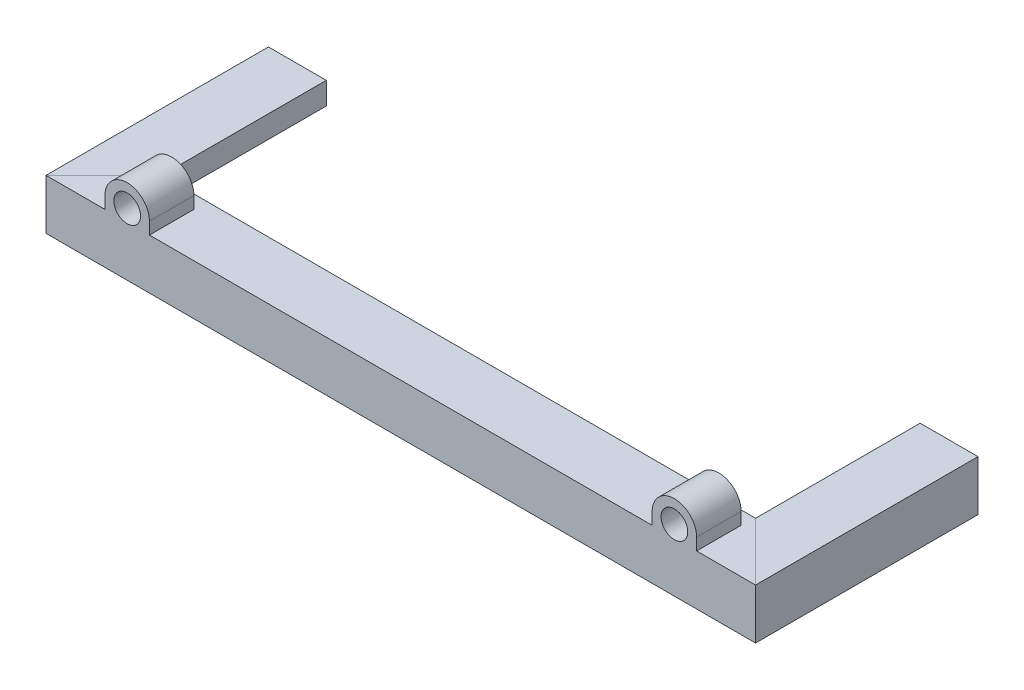
ISO-10303-21;
HEADER;
FILE_DESCRIPTION(('STEP AP214'),'2;1');
FILE_NAME('part.step','',(''),(''),'','','');
FILE_SCHEMA(('AUTOMOTIVE_DESIGN { 1 0 10303 214 1 1 1 1 }'));
ENDSEC;
DATA;
#1=APPLICATION_CONTEXT('core data for automotive mechanical design processes');
#2=APPLICATION_PROTOCOL_DEFINITION('international standard','automotive_design',2000,#1);
#3=PRODUCT_CONTEXT('',#1,'mechanical');
#4=PRODUCT('Part','Part','',(#3));
#5=PRODUCT_RELATED_PRODUCT_CATEGORY('part','',(#4));
#6=PRODUCT_DEFINITION_FORMATION('','',#4);
#7=PRODUCT_DEFINITION_CONTEXT('part definition',#1,'design');
#8=PRODUCT_DEFINITION('design','',#6,#7);
#9=PRODUCT_DEFINITION_SHAPE('','',#8);
#10=(LENGTH_UNIT() NAMED_UNIT(*) SI_UNIT(.MILLI.,.METRE.));
#11=(NAMED_UNIT(*) PLANE_ANGLE_UNIT() SI_UNIT($,.RADIAN.));
#12=(NAMED_UNIT(*) SI_UNIT($,.STERADIAN.) SOLID_ANGLE_UNIT());
#13=UNCERTAINTY_MEASURE_WITH_UNIT(LENGTH_MEASURE(1.E-05),#10,'distance_accuracy_value','');
#14=(GEOMETRIC_REPRESENTATION_CONTEXT(3) GLOBAL_UNCERTAINTY_ASSIGNED_CONTEXT((#13)) GLOBAL_UNIT_ASSIGNED_CONTEXT((#10,
#11,#12)) REPRESENTATION_CONTEXT('',''));
#15=CARTESIAN_POINT('',(0.,0.,0.));
#16=DIRECTION('',(0.,0.,1.));
#17=DIRECTION('',(1.,0.,0.));
#18=AXIS2_PLACEMENT_3D('',#15,#16,#17);
#19=CARTESIAN_POINT('',(0.,11.3,50.));
#20=DIRECTION('',(0.,1.,0.));
#21=DIRECTION('',(0.,0.,1.));
#22=AXIS2_PLACEMENT_3D('',#19,#20,#21);
#23=PLANE('',#22);
#24=DIRECTION('',(-1.,0.,0.));
#25=VECTOR('',#24,1.);
#26=CARTESIAN_POINT('',(146.25,11.3,40.));
#27=LINE('',#26,#25);
#28=CARTESIAN_POINT('',(139.942330316938,11.3,40.));
#29=VERTEX_POINT('',#28);
#30=CARTESIAN_POINT('',(136.25,11.3,40.));
#31=VERTEX_POINT('',#30);
#32=EDGE_CURVE('E228',#29,#31,#27,.T.);
#33=ORIENTED_EDGE('',*,*,#32,.F.);
#34=DIRECTION('',(0.,0.,1.));
#35=VECTOR('',#34,1.);
#36=CARTESIAN_POINT('',(139.942330316938,11.3,0.));
#37=LINE('',#36,#35);
#38=CARTESIAN_POINT('',(139.942330316938,11.3,37.));
#39=VERTEX_POINT('',#38);
#40=EDGE_CURVE('E58',#29,#39,#37,.F.);
#41=ORIENTED_EDGE('',*,*,#40,.T.);
#42=DIRECTION('',(1.,0.,0.));
#43=VECTOR('',#42,1.);
#44=CARTESIAN_POINT('',(0.,11.3,37.));
#45=LINE('',#44,#43);
#46=CARTESIAN_POINT('',(19.5576696830622,11.3,37.));
#47=VERTEX_POINT('',#46);
#48=EDGE_CURVE('E428',#47,#39,#45,.T.);
#49=ORIENTED_EDGE('',*,*,#48,.F.);
#50=DIRECTION('',(0.,0.,1.));
#51=VECTOR('',#50,1.);
#52=CARTESIAN_POINT('',(19.5576696830622,11.3,0.));
#53=LINE('',#52,#51);
#54=CARTESIAN_POINT('',(19.5576696830622,11.3,40.));
#55=VERTEX_POINT('',#54);
#56=EDGE_CURVE('E259',#55,#47,#53,.F.);
#57=ORIENTED_EDGE('',*,*,#56,.F.);
#58=DIRECTION('',(1.,0.,0.));
#59=VECTOR('',#58,1.);
#60=CARTESIAN_POINT('',(13.25,11.3,40.));
#61=LINE('',#60,#59);
#62=CARTESIAN_POINT('',(23.25,11.3,40.));
#63=VERTEX_POINT('',#62);
#64=EDGE_CURVE('E272',#55,#63,#61,.T.);
#65=ORIENTED_EDGE('',*,*,#64,.T.);
#66=DIRECTION('',(0.,0.,1.));
#67=VECTOR('',#66,1.);
#68=CARTESIAN_POINT('',(23.25,11.3,40.));
#69=LINE('',#68,#67);
#70=CARTESIAN_POINT('',(23.25,11.3,50.));
#71=VERTEX_POINT('',#70);
#72=EDGE_CURVE('E302',#63,#71,#69,.T.);
#73=ORIENTED_EDGE('',*,*,#72,.T.);
#74=DIRECTION('',(1.,0.,0.));
#75=VECTOR('',#74,1.);
#76=CARTESIAN_POINT('',(0.,11.3,50.));
#77=LINE('',#76,#75);
#78=CARTESIAN_POINT('',(136.25,11.3,50.));
#79=VERTEX_POINT('',#78);
#80=EDGE_CURVE('E389',#71,#79,#77,.T.);
#81=ORIENTED_EDGE('',*,*,#80,.T.);
#82=DIRECTION('',(0.,0.,1.));
#83=VECTOR('',#82,1.);
#84=CARTESIAN_POINT('',(136.25,11.3,40.));
#85=LINE('',#84,#83);
#86=EDGE_CURVE('E247',#31,#79,#85,.T.);
#87=ORIENTED_EDGE('',*,*,#86,.F.);
#88=EDGE_LOOP('',(#33,#41,#49,#57,#65,#73,#81,#87));
#89=FACE_BOUND('',#88,.T.);
#90=ADVANCED_FACE('F44',(#89),#23,.T.);
#91=CARTESIAN_POINT('',(142.557669683062,11.3,37.));
#92=VERTEX_POINT('',#91);
#93=CARTESIAN_POINT('',(146.5,11.3,37.));
#94=VERTEX_POINT('',#93);
#95=EDGE_CURVE('E217',#92,#94,#45,.T.);
#96=ORIENTED_EDGE('',*,*,#95,.F.);
#97=DIRECTION('',(0.,0.,1.));
#98=VECTOR('',#97,1.);
#99=CARTESIAN_POINT('',(142.557669683062,11.3,0.));
#100=LINE('',#99,#98);
#101=CARTESIAN_POINT('',(142.557669683062,11.3,40.));
#102=VERTEX_POINT('',#101);
#103=EDGE_CURVE('E210',#92,#102,#100,.T.);
#104=ORIENTED_EDGE('',*,*,#103,.T.);
#105=CARTESIAN_POINT('',(146.25,11.3,40.));
#106=VERTEX_POINT('',#105);
#107=EDGE_CURVE('E216',#106,#102,#27,.T.);
#108=ORIENTED_EDGE('',*,*,#107,.F.);
#109=DIRECTION('',(0.,0.,1.));
#110=VECTOR('',#109,1.);
#111=CARTESIAN_POINT('',(146.25,11.3,40.));
#112=LINE('',#111,#110);
#113=CARTESIAN_POINT('',(146.25,11.3,50.));
#114=VERTEX_POINT('',#113);
#115=EDGE_CURVE('E66',#106,#114,#112,.T.);
#116=ORIENTED_EDGE('',*,*,#115,.T.);
#117=CARTESIAN_POINT('',(159.5,11.3,50.));
#118=VERTEX_POINT('',#117);
#119=EDGE_CURVE('E386',#114,#118,#77,.T.);
#120=ORIENTED_EDGE('',*,*,#119,.T.);
#121=DIRECTION('',(-0.707106781186548,0.,-0.707106781186548));
#122=VECTOR('',#121,1.);
#123=CARTESIAN_POINT('',(79.75,11.3,-29.75));
#124=LINE('',#123,#122);
#125=EDGE_CURVE('E398',#118,#94,#124,.T.);
#126=ORIENTED_EDGE('',*,*,#125,.T.);
#127=EDGE_LOOP('',(#96,#104,#108,#116,#120,#126));
#128=FACE_BOUND('',#127,.T.);
#129=ADVANCED_FACE('F214',(#128),#23,.T.);
#130=DIRECTION('',(0.,0.,1.));
#131=VECTOR('',#130,1.);
#132=CARTESIAN_POINT('',(16.9423303169378,11.3,0.));
#133=LINE('',#132,#131);
#134=CARTESIAN_POINT('',(16.9423303169378,11.3,37.));
#135=VERTEX_POINT('',#134);
#136=CARTESIAN_POINT('',(16.9423303169378,11.3,40.));
#137=VERTEX_POINT('',#136);
#138=EDGE_CURVE('E265',#135,#137,#133,.T.);
#139=ORIENTED_EDGE('',*,*,#138,.F.);
#140=CARTESIAN_POINT('',(13.,11.3,37.));
#141=VERTEX_POINT('',#140);
#142=EDGE_CURVE('E424',#141,#135,#45,.T.);
#143=ORIENTED_EDGE('',*,*,#142,.F.);
#144=DIRECTION('',(0.707106781186547,0.,-0.707106781186547));
#145=VECTOR('',#144,1.);
#146=CARTESIAN_POINT('',(25.,11.3,25.));
#147=LINE('',#146,#145);
#148=CARTESIAN_POINT('',(0.,11.3,50.));
#149=VERTEX_POINT('',#148);
#150=EDGE_CURVE('E349',#149,#141,#147,.T.);
#151=ORIENTED_EDGE('',*,*,#150,.F.);
#152=CARTESIAN_POINT('',(13.25,11.3,50.));
#153=VERTEX_POINT('',#152);
#154=EDGE_CURVE('E382',#149,#153,#77,.T.);
#155=ORIENTED_EDGE('',*,*,#154,.T.);
#156=DIRECTION('',(0.,0.,1.));
#157=VECTOR('',#156,1.);
#158=CARTESIAN_POINT('',(13.25,11.3,40.));
#159=LINE('',#158,#157);
#160=CARTESIAN_POINT('',(13.25,11.3,40.));
#161=VERTEX_POINT('',#160);
#162=EDGE_CURVE('E290',#161,#153,#159,.T.);
#163=ORIENTED_EDGE('',*,*,#162,.F.);
#164=EDGE_CURVE('E274',#161,#137,#61,.T.);
#165=ORIENTED_EDGE('',*,*,#164,.T.);
#166=EDGE_LOOP('',(#139,#143,#151,#155,#163,#165));
#167=FACE_BOUND('',#166,.T.);
#168=ADVANCED_FACE('F483',(#167),#23,.T.);
#169=CARTESIAN_POINT('',(159.5,0.,0.));
#170=DIRECTION('',(0.,0.,1.));
#171=DIRECTION('',(1.,0.,0.));
#172=AXIS2_PLACEMENT_3D('',#169,#170,#171);
#173=PLANE('',#172);
#174=DIRECTION('',(-1.,0.,0.));
#175=VECTOR('',#174,1.);
#176=CARTESIAN_POINT('',(154.5,0.,0.));
#177=LINE('',#176,#175);
#178=CARTESIAN_POINT('',(159.5,0.,0.));
#179=VERTEX_POINT('',#178);
#180=CARTESIAN_POINT('',(154.5,0.,0.));
#181=VERTEX_POINT('',#180);
#182=EDGE_CURVE('E434',#179,#181,#177,.T.);
#183=ORIENTED_EDGE('',*,*,#182,.T.);
#184=DIRECTION('',(0.,1.,0.));
#185=VECTOR('',#184,1.);
#186=CARTESIAN_POINT('',(154.5,6.3,0.));
#187=LINE('',#186,#185);
#188=CARTESIAN_POINT('',(154.5,6.3,0.));
#189=VERTEX_POINT('',#188);
#190=EDGE_CURVE('E303',#181,#189,#187,.T.);
#191=ORIENTED_EDGE('',*,*,#190,.T.);
#192=DIRECTION('',(-1.,0.,0.));
#193=VECTOR('',#192,1.);
#194=CARTESIAN_POINT('',(146.5,6.3,0.));
#195=LINE('',#194,#193);
#196=CARTESIAN_POINT('',(146.5,6.3,0.));
#197=VERTEX_POINT('',#196);
#198=EDGE_CURVE('E460',#189,#197,#195,.T.);
#199=ORIENTED_EDGE('',*,*,#198,.T.);
#200=DIRECTION('',(0.,1.,0.));
#201=VECTOR('',#200,1.);
#202=CARTESIAN_POINT('',(146.5,11.3,0.));
#203=LINE('',#202,#201);
#204=CARTESIAN_POINT('',(146.5,11.3,0.));
#205=VERTEX_POINT('',#204);
#206=EDGE_CURVE('E451',#197,#205,#203,.T.);
#207=ORIENTED_EDGE('',*,*,#206,.T.);
#208=DIRECTION('',(1.,0.,0.));
#209=VECTOR('',#208,1.);
#210=CARTESIAN_POINT('',(159.5,11.3,0.));
#211=LINE('',#210,#209);
#212=CARTESIAN_POINT('',(159.5,11.3,0.));
#213=VERTEX_POINT('',#212);
#214=EDGE_CURVE('E450',#205,#213,#211,.T.);
#215=ORIENTED_EDGE('',*,*,#214,.T.);
#216=DIRECTION('',(0.,-1.,0.));
#217=VECTOR('',#216,1.);
#218=CARTESIAN_POINT('',(159.5,0.,0.));
#219=LINE('',#218,#217);
#220=EDGE_CURVE('E445',#213,#179,#219,.T.);
#221=ORIENTED_EDGE('',*,*,#220,.T.);
#222=EDGE_LOOP('',(#183,#191,#199,#207,#215,#221));
#223=FACE_BOUND('',#222,.T.);
#224=ADVANCED_FACE('F50',(#223),#173,.F.);
#225=CARTESIAN_POINT('',(0.,0.,0.));
#226=DIRECTION('',(0.,0.,-1.));
#227=DIRECTION('',(-1.,0.,0.));
#228=AXIS2_PLACEMENT_3D('',#225,#226,#227);
#229=PLANE('',#228);
#230=DIRECTION('',(1.,0.,0.));
#231=VECTOR('',#230,1.);
#232=CARTESIAN_POINT('',(5.,0.,0.));
#233=LINE('',#232,#231);
#234=CARTESIAN_POINT('',(0.,0.,0.));
#235=VERTEX_POINT('',#234);
#236=CARTESIAN_POINT('',(5.,0.,0.));
#237=VERTEX_POINT('',#236);
#238=EDGE_CURVE('E312',#235,#237,#233,.T.);
#239=ORIENTED_EDGE('',*,*,#238,.F.);
#240=DIRECTION('',(0.,-1.,0.));
#241=VECTOR('',#240,1.);
#242=CARTESIAN_POINT('',(0.,0.,0.));
#243=LINE('',#242,#241);
#244=CARTESIAN_POINT('',(0.,11.3,0.));
#245=VERTEX_POINT('',#244);
#246=EDGE_CURVE('E319',#245,#235,#243,.T.);
#247=ORIENTED_EDGE('',*,*,#246,.F.);
#248=DIRECTION('',(-1.,0.,0.));
#249=VECTOR('',#248,1.);
#250=CARTESIAN_POINT('',(0.,11.3,0.));
#251=LINE('',#250,#249);
#252=CARTESIAN_POINT('',(13.,11.3,0.));
#253=VERTEX_POINT('',#252);
#254=EDGE_CURVE('E334',#253,#245,#251,.T.);
#255=ORIENTED_EDGE('',*,*,#254,.F.);
#256=DIRECTION('',(0.,1.,0.));
#257=VECTOR('',#256,1.);
#258=CARTESIAN_POINT('',(13.,11.3,0.));
#259=LINE('',#258,#257);
#260=CARTESIAN_POINT('',(13.,6.3,0.));
#261=VERTEX_POINT('',#260);
#262=EDGE_CURVE('E343',#261,#253,#259,.T.);
#263=ORIENTED_EDGE('',*,*,#262,.F.);
#264=DIRECTION('',(1.,0.,0.));
#265=VECTOR('',#264,1.);
#266=CARTESIAN_POINT('',(13.,6.3,0.));
#267=LINE('',#266,#265);
#268=CARTESIAN_POINT('',(5.,6.3,0.));
#269=VERTEX_POINT('',#268);
#270=EDGE_CURVE('E342',#269,#261,#267,.T.);
#271=ORIENTED_EDGE('',*,*,#270,.F.);
#272=DIRECTION('',(0.,1.,0.));
#273=VECTOR('',#272,1.);
#274=CARTESIAN_POINT('',(5.,6.3,0.));
#275=LINE('',#274,#273);
#276=EDGE_CURVE('E313',#237,#269,#275,.T.);
#277=ORIENTED_EDGE('',*,*,#276,.F.);
#278=EDGE_LOOP('',(#239,#247,#255,#263,#271,#277));
#279=FACE_BOUND('',#278,.T.);
#280=ADVANCED_FACE('F535',(#279),#229,.T.);
#281=CARTESIAN_POINT('',(146.5,6.3,50.));
#282=DIRECTION('',(0.,-1.,0.));
#283=DIRECTION('',(1.,0.,0.));
#284=AXIS2_PLACEMENT_3D('',#281,#282,#283);
#285=PLANE('',#284);
#286=DIRECTION('',(0.707106781186548,0.,0.707106781186548));
#287=VECTOR('',#286,1.);
#288=CARTESIAN_POINT('',(73.25,6.30000000000002,-36.25));
#289=LINE('',#288,#287);
#290=CARTESIAN_POINT('',(146.5,6.3,37.));
#291=VERTEX_POINT('',#290);
#292=CARTESIAN_POINT('',(154.5,6.3,45.));
#293=VERTEX_POINT('',#292);
#294=EDGE_CURVE('E404',#291,#293,#289,.T.);
#295=ORIENTED_EDGE('',*,*,#294,.F.);
#296=DIRECTION('',(0.,0.,-1.));
#297=VECTOR('',#296,1.);
#298=CARTESIAN_POINT('',(146.5,6.3,50.));
#299=LINE('',#298,#297);
#300=EDGE_CURVE('E457',#291,#197,#299,.T.);
#301=ORIENTED_EDGE('',*,*,#300,.T.);
#302=ORIENTED_EDGE('',*,*,#198,.F.);
#303=DIRECTION('',(0.,0.,-1.));
#304=VECTOR('',#303,1.);
#305=CARTESIAN_POINT('',(154.5,6.3,50.));
#306=LINE('',#305,#304);
#307=EDGE_CURVE('E418',#293,#189,#306,.T.);
#308=ORIENTED_EDGE('',*,*,#307,.F.);
#309=EDGE_LOOP('',(#295,#301,#302,#308));
#310=FACE_BOUND('',#309,.T.);
#311=ADVANCED_FACE('F554',(#310),#285,.T.);
#312=CARTESIAN_POINT('',(146.5,11.3,50.));
#313=DIRECTION('',(-1.,0.,0.));
#314=DIRECTION('',(0.,0.,1.));
#315=AXIS2_PLACEMENT_3D('',#312,#313,#314);
#316=PLANE('',#315);
#317=DIRECTION('',(0.,-1.,0.));
#318=VECTOR('',#317,1.);
#319=CARTESIAN_POINT('',(146.5,11.3,37.));
#320=LINE('',#319,#318);
#321=EDGE_CURVE('E399',#94,#291,#320,.T.);
#322=ORIENTED_EDGE('',*,*,#321,.F.);
#323=DIRECTION('',(0.,0.,-1.));
#324=VECTOR('',#323,1.);
#325=CARTESIAN_POINT('',(146.5,11.3,50.));
#326=LINE('',#325,#324);
#327=EDGE_CURVE('E455',#94,#205,#326,.T.);
#328=ORIENTED_EDGE('',*,*,#327,.T.);
#329=ORIENTED_EDGE('',*,*,#206,.F.);
#330=ORIENTED_EDGE('',*,*,#300,.F.);
#331=EDGE_LOOP('',(#322,#328,#329,#330));
#332=FACE_BOUND('',#331,.T.);
#333=ADVANCED_FACE('F557',(#332),#316,.T.);
#334=CARTESIAN_POINT('',(159.5,11.3,50.));
#335=DIRECTION('',(0.,1.,0.));
#336=DIRECTION('',(0.,0.,1.));
#337=AXIS2_PLACEMENT_3D('',#334,#335,#336);
#338=PLANE('',#337);
#339=ORIENTED_EDGE('',*,*,#125,.F.);
#340=DIRECTION('',(0.,0.,-1.));
#341=VECTOR('',#340,1.);
#342=CARTESIAN_POINT('',(159.5,11.3,50.));
#343=LINE('',#342,#341);
#344=EDGE_CURVE('E443',#118,#213,#343,.T.);
#345=ORIENTED_EDGE('',*,*,#344,.T.);
#346=ORIENTED_EDGE('',*,*,#214,.F.);
#347=ORIENTED_EDGE('',*,*,#327,.F.);
#348=EDGE_LOOP('',(#339,#345,#346,#347));
#349=FACE_BOUND('',#348,.T.);
#350=ADVANCED_FACE('F514',(#349),#338,.T.);
#351=CARTESIAN_POINT('',(159.5,0.,50.));
#352=DIRECTION('',(1.,0.,0.));
#353=DIRECTION('',(0.,0.,-1.));
#354=AXIS2_PLACEMENT_3D('',#351,#352,#353);
#355=PLANE('',#354);
#356=DIRECTION('',(0.,0.,-1.));
#357=VECTOR('',#356,1.);
#358=CARTESIAN_POINT('',(159.5,0.,50.));
#359=LINE('',#358,#357);
#360=CARTESIAN_POINT('',(159.5,0.,50.));
#361=VERTEX_POINT('',#360);
#362=EDGE_CURVE('E437',#361,#179,#359,.T.);
#363=ORIENTED_EDGE('',*,*,#362,.T.);
#364=ORIENTED_EDGE('',*,*,#220,.F.);
#365=ORIENTED_EDGE('',*,*,#344,.F.);
#366=DIRECTION('',(0.,-1.,0.));
#367=VECTOR('',#366,1.);
#368=CARTESIAN_POINT('',(159.5,0.,50.));
#369=LINE('',#368,#367);
#370=EDGE_CURVE('E390',#118,#361,#369,.T.);
#371=ORIENTED_EDGE('',*,*,#370,.T.);
#372=EDGE_LOOP('',(#363,#364,#365,#371));
#373=FACE_BOUND('',#372,.T.);
#374=ADVANCED_FACE('F517',(#373),#355,.T.);
#375=CARTESIAN_POINT('',(154.5,0.,50.));
#376=DIRECTION('',(0.,-1.,0.));
#377=DIRECTION('',(1.,0.,0.));
#378=AXIS2_PLACEMENT_3D('',#375,#376,#377);
#379=PLANE('',#378);
#380=DIRECTION('',(0.707106781186548,0.,0.707106781186548));
#381=VECTOR('',#380,1.);
#382=CARTESIAN_POINT('',(77.25,0.,-32.25));
#383=LINE('',#382,#381);
#384=CARTESIAN_POINT('',(154.5,0.,45.));
#385=VERTEX_POINT('',#384);
#386=EDGE_CURVE('E415',#385,#361,#383,.T.);
#387=ORIENTED_EDGE('',*,*,#386,.F.);
#388=DIRECTION('',(0.,0.,-1.));
#389=VECTOR('',#388,1.);
#390=CARTESIAN_POINT('',(154.5,0.,50.));
#391=LINE('',#390,#389);
#392=EDGE_CURVE('E432',#385,#181,#391,.T.);
#393=ORIENTED_EDGE('',*,*,#392,.T.);
#394=ORIENTED_EDGE('',*,*,#182,.F.);
#395=ORIENTED_EDGE('',*,*,#362,.F.);
#396=EDGE_LOOP('',(#387,#393,#394,#395));
#397=FACE_BOUND('',#396,.T.);
#398=ADVANCED_FACE('F773',(#397),#379,.T.);
#399=CARTESIAN_POINT('',(154.5,6.3,50.));
#400=DIRECTION('',(-1.,0.,0.));
#401=DIRECTION('',(0.,-1.,0.));
#402=AXIS2_PLACEMENT_3D('',#399,#400,#401);
#403=PLANE('',#402);
#404=DIRECTION('',(0.,-1.,0.));
#405=VECTOR('',#404,1.);
#406=CARTESIAN_POINT('',(154.5,6.29999999999998,45.));
#407=LINE('',#406,#405);
#408=EDGE_CURVE('E397',#293,#385,#407,.T.);
#409=ORIENTED_EDGE('',*,*,#408,.F.);
#410=ORIENTED_EDGE('',*,*,#307,.T.);
#411=ORIENTED_EDGE('',*,*,#190,.F.);
#412=ORIENTED_EDGE('',*,*,#392,.F.);
#413=EDGE_LOOP('',(#409,#410,#411,#412));
#414=FACE_BOUND('',#413,.T.);
#415=ADVANCED_FACE('F621',(#414),#403,.T.);
#416=CARTESIAN_POINT('',(0.,0.,50.));
#417=DIRECTION('',(0.,0.,1.));
#418=DIRECTION('',(1.,0.,0.));
#419=AXIS2_PLACEMENT_3D('',#416,#417,#418);
#420=PLANE('',#419);
#421=CARTESIAN_POINT('',(141.25,14.,50.));
#422=DIRECTION('',(0.,0.,-1.));
#423=DIRECTION('',(-1.,0.,0.));
#424=AXIS2_PLACEMENT_3D('',#421,#422,#423);
#425=CIRCLE('',#424,3.);
#426=CARTESIAN_POINT('',(138.25,14.,50.));
#427=VERTEX_POINT('',#426);
#428=EDGE_CURVE('E219',#427,#427,#425,.T.);
#429=ORIENTED_EDGE('',*,*,#428,.T.);
#430=EDGE_LOOP('',(#429));
#431=FACE_BOUND('',#430,.T.);
#432=CARTESIAN_POINT('',(18.25,14.,50.));
#433=DIRECTION('',(0.,0.,1.));
#434=DIRECTION('',(1.,0.,0.));
#435=AXIS2_PLACEMENT_3D('',#432,#433,#434);
#436=CIRCLE('',#435,3.);
#437=CARTESIAN_POINT('',(21.25,14.,50.));
#438=VERTEX_POINT('',#437);
#439=EDGE_CURVE('E249',#438,#438,#436,.T.);
#440=ORIENTED_EDGE('',*,*,#439,.F.);
#441=EDGE_LOOP('',(#440));
#442=FACE_BOUND('',#441,.T.);
#443=DIRECTION('',(1.,0.,0.));
#444=VECTOR('',#443,1.);
#445=CARTESIAN_POINT('',(0.,0.,50.));
#446=LINE('',#445,#444);
#447=CARTESIAN_POINT('',(0.,0.,50.));
#448=VERTEX_POINT('',#447);
#449=EDGE_CURVE('E394',#448,#361,#446,.T.);
#450=ORIENTED_EDGE('',*,*,#449,.T.);
#451=ORIENTED_EDGE('',*,*,#370,.F.);
#452=ORIENTED_EDGE('',*,*,#119,.F.);
#453=DIRECTION('',(0.,-1.,0.));
#454=VECTOR('',#453,1.);
#455=CARTESIAN_POINT('',(146.25,11.3,50.));
#456=LINE('',#455,#454);
#457=CARTESIAN_POINT('',(146.25,14.,50.));
#458=VERTEX_POINT('',#457);
#459=EDGE_CURVE('E240',#458,#114,#456,.T.);
#460=ORIENTED_EDGE('',*,*,#459,.F.);
#461=CARTESIAN_POINT('',(141.25,14.,50.));
#462=DIRECTION('',(0.,0.,-1.));
#463=DIRECTION('',(-1.,0.,0.));
#464=AXIS2_PLACEMENT_3D('',#461,#462,#463);
#465=CIRCLE('',#464,5.);
#466=CARTESIAN_POINT('',(136.25,14.,50.));
#467=VERTEX_POINT('',#466);
#468=EDGE_CURVE('E238',#467,#458,#465,.T.);
#469=ORIENTED_EDGE('',*,*,#468,.F.);
#470=DIRECTION('',(0.,1.,0.));
#471=VECTOR('',#470,1.);
#472=CARTESIAN_POINT('',(136.25,11.3,50.));
#473=LINE('',#472,#471);
#474=EDGE_CURVE('E245',#79,#467,#473,.T.);
#475=ORIENTED_EDGE('',*,*,#474,.F.);
#476=ORIENTED_EDGE('',*,*,#80,.F.);
#477=DIRECTION('',(0.,1.,0.));
#478=VECTOR('',#477,1.);
#479=CARTESIAN_POINT('',(23.25,11.3,50.));
#480=LINE('',#479,#478);
#481=CARTESIAN_POINT('',(23.25,14.,50.));
#482=VERTEX_POINT('',#481);
#483=EDGE_CURVE('E292',#71,#482,#480,.T.);
#484=ORIENTED_EDGE('',*,*,#483,.T.);
#485=CARTESIAN_POINT('',(18.25,14.,50.));
#486=DIRECTION('',(0.,0.,1.));
#487=DIRECTION('',(1.,0.,0.));
#488=AXIS2_PLACEMENT_3D('',#485,#486,#487);
#489=CIRCLE('',#488,5.);
#490=CARTESIAN_POINT('',(13.25,14.,50.));
#491=VERTEX_POINT('',#490);
#492=EDGE_CURVE('E273',#482,#491,#489,.T.);
#493=ORIENTED_EDGE('',*,*,#492,.T.);
#494=DIRECTION('',(0.,-1.,0.));
#495=VECTOR('',#494,1.);
#496=CARTESIAN_POINT('',(13.25,11.3,50.));
#497=LINE('',#496,#495);
#498=EDGE_CURVE('E268',#491,#153,#497,.T.);
#499=ORIENTED_EDGE('',*,*,#498,.T.);
#500=ORIENTED_EDGE('',*,*,#154,.F.);
#501=DIRECTION('',(0.,-1.,0.));
#502=VECTOR('',#501,1.);
#503=CARTESIAN_POINT('',(0.,0.,50.));
#504=LINE('',#503,#502);
#505=EDGE_CURVE('E324',#149,#448,#504,.T.);
#506=ORIENTED_EDGE('',*,*,#505,.T.);
#507=EDGE_LOOP('',(#450,#451,#452,#460,#469,#475,#476,#484,#493,#499,#500,#506));
#508=FACE_BOUND('',#507,.T.);
#509=ADVANCED_FACE('F489',(#431,#442,#508),#420,.T.);
#510=CARTESIAN_POINT('',(0.,6.3,37.));
#511=DIRECTION('',(0.,-1.,0.));
#512=DIRECTION('',(0.,0.,-1.));
#513=AXIS2_PLACEMENT_3D('',#510,#511,#512);
#514=PLANE('',#513);
#515=DIRECTION('',(1.,0.,0.));
#516=VECTOR('',#515,1.);
#517=CARTESIAN_POINT('',(0.,6.3,37.));
#518=LINE('',#517,#516);
#519=CARTESIAN_POINT('',(13.,6.3,37.));
#520=VERTEX_POINT('',#519);
#521=EDGE_CURVE('E419',#520,#291,#518,.T.);
#522=ORIENTED_EDGE('',*,*,#521,.T.);
#523=ORIENTED_EDGE('',*,*,#294,.T.);
#524=DIRECTION('',(1.,0.,0.));
#525=VECTOR('',#524,1.);
#526=CARTESIAN_POINT('',(0.,6.3,45.));
#527=LINE('',#526,#525);
#528=CARTESIAN_POINT('',(5.,6.3,45.));
#529=VERTEX_POINT('',#528);
#530=EDGE_CURVE('E407',#529,#293,#527,.T.);
#531=ORIENTED_EDGE('',*,*,#530,.F.);
#532=DIRECTION('',(-0.707106781186548,0.,0.707106781186548));
#533=VECTOR('',#532,1.);
#534=CARTESIAN_POINT('',(31.5,6.30000000000001,18.5));
#535=LINE('',#534,#533);
#536=EDGE_CURVE('E356',#520,#529,#535,.T.);
#537=ORIENTED_EDGE('',*,*,#536,.F.);
#538=EDGE_LOOP('',(#522,#523,#531,#537));
#539=FACE_BOUND('',#538,.T.);
#540=ADVANCED_FACE('F547',(#539),#514,.T.);
#541=CARTESIAN_POINT('',(0.,11.3,37.));
#542=DIRECTION('',(0.,0.,-1.));
#543=DIRECTION('',(-1.,0.,0.));
#544=AXIS2_PLACEMENT_3D('',#541,#542,#543);
#545=PLANE('',#544);
#546=ORIENTED_EDGE('',*,*,#48,.T.);
#547=CARTESIAN_POINT('',(141.25,14.,37.));
#548=DIRECTION('',(0.,0.,-1.));
#549=DIRECTION('',(-1.,0.,0.));
#550=AXIS2_PLACEMENT_3D('',#547,#548,#549);
#551=CIRCLE('',#550,3.);
#552=EDGE_CURVE('E243',#39,#92,#551,.F.);
#553=ORIENTED_EDGE('',*,*,#552,.T.);
#554=ORIENTED_EDGE('',*,*,#95,.T.);
#555=ORIENTED_EDGE('',*,*,#321,.T.);
#556=ORIENTED_EDGE('',*,*,#521,.F.);
#557=DIRECTION('',(0.,-1.,0.));
#558=VECTOR('',#557,1.);
#559=CARTESIAN_POINT('',(13.,11.3,37.));
#560=LINE('',#559,#558);
#561=EDGE_CURVE('E352',#141,#520,#560,.T.);
#562=ORIENTED_EDGE('',*,*,#561,.F.);
#563=ORIENTED_EDGE('',*,*,#142,.T.);
#564=CARTESIAN_POINT('',(18.25,14.,37.));
#565=DIRECTION('',(0.,0.,-1.));
#566=DIRECTION('',(-1.,0.,0.));
#567=AXIS2_PLACEMENT_3D('',#564,#565,#566);
#568=CIRCLE('',#567,3.);
#569=EDGE_CURVE('E264',#47,#135,#568,.T.);
#570=ORIENTED_EDGE('',*,*,#569,.F.);
#571=EDGE_LOOP('',(#546,#553,#554,#555,#556,#562,#563,#570));
#572=FACE_BOUND('',#571,.T.);
#573=ADVANCED_FACE('F563',(#572),#545,.T.);
#574=CARTESIAN_POINT('',(0.,0.,45.));
#575=DIRECTION('',(0.,-1.,0.));
#576=DIRECTION('',(0.,0.,-1.));
#577=AXIS2_PLACEMENT_3D('',#574,#575,#576);
#578=PLANE('',#577);
#579=DIRECTION('',(1.,0.,0.));
#580=VECTOR('',#579,1.);
#581=CARTESIAN_POINT('',(0.,0.,45.));
#582=LINE('',#581,#580);
#583=CARTESIAN_POINT('',(5.,0.,45.));
#584=VERTEX_POINT('',#583);
#585=EDGE_CURVE('E369',#584,#385,#582,.T.);
#586=ORIENTED_EDGE('',*,*,#585,.T.);
#587=ORIENTED_EDGE('',*,*,#386,.T.);
#588=ORIENTED_EDGE('',*,*,#449,.F.);
#589=DIRECTION('',(-0.707106781186548,0.,0.707106781186548));
#590=VECTOR('',#589,1.);
#591=CARTESIAN_POINT('',(27.5,0.,22.5));
#592=LINE('',#591,#590);
#593=EDGE_CURVE('E364',#584,#448,#592,.T.);
#594=ORIENTED_EDGE('',*,*,#593,.F.);
#595=EDGE_LOOP('',(#586,#587,#588,#594));
#596=FACE_BOUND('',#595,.T.);
#597=ADVANCED_FACE('F525',(#596),#578,.T.);
#598=CARTESIAN_POINT('',(0.,6.3,45.));
#599=DIRECTION('',(0.,0.,-1.));
#600=DIRECTION('',(0.,1.,0.));
#601=AXIS2_PLACEMENT_3D('',#598,#599,#600);
#602=PLANE('',#601);
#603=ORIENTED_EDGE('',*,*,#530,.T.);
#604=ORIENTED_EDGE('',*,*,#408,.T.);
#605=ORIENTED_EDGE('',*,*,#585,.F.);
#606=DIRECTION('',(0.,-1.,0.));
#607=VECTOR('',#606,1.);
#608=CARTESIAN_POINT('',(5.,6.29999999999999,45.));
#609=LINE('',#608,#607);
#610=EDGE_CURVE('E355',#529,#584,#609,.T.);
#611=ORIENTED_EDGE('',*,*,#610,.F.);
#612=EDGE_LOOP('',(#603,#604,#605,#611));
#613=FACE_BOUND('',#612,.T.);
#614=ADVANCED_FACE('F546',(#613),#602,.T.);
#615=CARTESIAN_POINT('',(0.,0.,0.));
#616=DIRECTION('',(-1.,0.,0.));
#617=DIRECTION('',(0.,0.,1.));
#618=AXIS2_PLACEMENT_3D('',#615,#616,#617);
#619=PLANE('',#618);
#620=DIRECTION('',(0.,0.,1.));
#621=VECTOR('',#620,1.);
#622=CARTESIAN_POINT('',(0.,0.,0.));
#623=LINE('',#622,#621);
#624=EDGE_CURVE('E321',#235,#448,#623,.T.);
#625=ORIENTED_EDGE('',*,*,#624,.T.);
#626=ORIENTED_EDGE('',*,*,#505,.F.);
#627=DIRECTION('',(0.,0.,1.));
#628=VECTOR('',#627,1.);
#629=CARTESIAN_POINT('',(0.,11.3,0.));
#630=LINE('',#629,#628);
#631=EDGE_CURVE('E328',#245,#149,#630,.T.);
#632=ORIENTED_EDGE('',*,*,#631,.F.);
#633=ORIENTED_EDGE('',*,*,#246,.T.);
#634=EDGE_LOOP('',(#625,#626,#632,#633));
#635=FACE_BOUND('',#634,.T.);
#636=ADVANCED_FACE('F530',(#635),#619,.T.);
#637=CARTESIAN_POINT('',(13.,6.3,0.));
#638=DIRECTION('',(0.,-1.,0.));
#639=DIRECTION('',(1.,0.,0.));
#640=AXIS2_PLACEMENT_3D('',#637,#638,#639);
#641=PLANE('',#640);
#642=DIRECTION('',(0.,0.,1.));
#643=VECTOR('',#642,1.);
#644=CARTESIAN_POINT('',(13.,6.3,0.));
#645=LINE('',#644,#643);
#646=EDGE_CURVE('E376',#261,#520,#645,.T.);
#647=ORIENTED_EDGE('',*,*,#646,.T.);
#648=ORIENTED_EDGE('',*,*,#536,.T.);
#649=DIRECTION('',(0.,0.,1.));
#650=VECTOR('',#649,1.);
#651=CARTESIAN_POINT('',(5.,6.3,0.));
#652=LINE('',#651,#650);
#653=EDGE_CURVE('E316',#269,#529,#652,.T.);
#654=ORIENTED_EDGE('',*,*,#653,.F.);
#655=ORIENTED_EDGE('',*,*,#270,.T.);
#656=EDGE_LOOP('',(#647,#648,#654,#655));
#657=FACE_BOUND('',#656,.T.);
#658=ADVANCED_FACE('F541',(#657),#641,.T.);
#659=CARTESIAN_POINT('',(13.,11.3,0.));
#660=DIRECTION('',(1.,0.,0.));
#661=DIRECTION('',(0.,0.,-1.));
#662=AXIS2_PLACEMENT_3D('',#659,#660,#661);
#663=PLANE('',#662);
#664=DIRECTION('',(0.,0.,1.));
#665=VECTOR('',#664,1.);
#666=CARTESIAN_POINT('',(13.,11.3,0.));
#667=LINE('',#666,#665);
#668=EDGE_CURVE('E339',#253,#141,#667,.T.);
#669=ORIENTED_EDGE('',*,*,#668,.T.);
#670=ORIENTED_EDGE('',*,*,#561,.T.);
#671=ORIENTED_EDGE('',*,*,#646,.F.);
#672=ORIENTED_EDGE('',*,*,#262,.T.);
#673=EDGE_LOOP('',(#669,#670,#671,#672));
#674=FACE_BOUND('',#673,.T.);
#675=ADVANCED_FACE('F540',(#674),#663,.T.);
#676=CARTESIAN_POINT('',(0.,11.3,0.));
#677=DIRECTION('',(0.,1.,0.));
#678=DIRECTION('',(0.,0.,1.));
#679=AXIS2_PLACEMENT_3D('',#676,#677,#678);
#680=PLANE('',#679);
#681=ORIENTED_EDGE('',*,*,#631,.T.);
#682=ORIENTED_EDGE('',*,*,#150,.T.);
#683=ORIENTED_EDGE('',*,*,#668,.F.);
#684=ORIENTED_EDGE('',*,*,#254,.T.);
#685=EDGE_LOOP('',(#681,#682,#683,#684));
#686=FACE_BOUND('',#685,.T.);
#687=ADVANCED_FACE('F532',(#686),#680,.T.);
#688=CARTESIAN_POINT('',(5.,0.,0.));
#689=DIRECTION('',(0.,-1.,0.));
#690=DIRECTION('',(1.,0.,0.));
#691=AXIS2_PLACEMENT_3D('',#688,#689,#690);
#692=PLANE('',#691);
#693=DIRECTION('',(0.,0.,1.));
#694=VECTOR('',#693,1.);
#695=CARTESIAN_POINT('',(5.,0.,0.));
#696=LINE('',#695,#694);
#697=EDGE_CURVE('E326',#237,#584,#696,.T.);
#698=ORIENTED_EDGE('',*,*,#697,.T.);
#699=ORIENTED_EDGE('',*,*,#593,.T.);
#700=ORIENTED_EDGE('',*,*,#624,.F.);
#701=ORIENTED_EDGE('',*,*,#238,.T.);
#702=EDGE_LOOP('',(#698,#699,#700,#701));
#703=FACE_BOUND('',#702,.T.);
#704=ADVANCED_FACE('F528',(#703),#692,.T.);
#705=CARTESIAN_POINT('',(5.,6.3,0.));
#706=DIRECTION('',(1.,0.,0.));
#707=DIRECTION('',(0.,1.,0.));
#708=AXIS2_PLACEMENT_3D('',#705,#706,#707);
#709=PLANE('',#708);
#710=ORIENTED_EDGE('',*,*,#653,.T.);
#711=ORIENTED_EDGE('',*,*,#610,.T.);
#712=ORIENTED_EDGE('',*,*,#697,.F.);
#713=ORIENTED_EDGE('',*,*,#276,.T.);
#714=EDGE_LOOP('',(#710,#711,#712,#713));
#715=FACE_BOUND('',#714,.T.);
#716=ADVANCED_FACE('F543',(#715),#709,.T.);
#717=CARTESIAN_POINT('',(13.25,11.3,40.));
#718=DIRECTION('',(-1.,0.,0.));
#719=DIRECTION('',(0.,0.,1.));
#720=AXIS2_PLACEMENT_3D('',#717,#718,#719);
#721=PLANE('',#720);
#722=ORIENTED_EDGE('',*,*,#498,.F.);
#723=DIRECTION('',(0.,0.,1.));
#724=VECTOR('',#723,1.);
#725=CARTESIAN_POINT('',(13.25,14.,40.));
#726=LINE('',#725,#724);
#727=CARTESIAN_POINT('',(13.25,14.,40.));
#728=VERTEX_POINT('',#727);
#729=EDGE_CURVE('E297',#728,#491,#726,.T.);
#730=ORIENTED_EDGE('',*,*,#729,.F.);
#731=DIRECTION('',(0.,-1.,0.));
#732=VECTOR('',#731,1.);
#733=CARTESIAN_POINT('',(13.25,11.3,40.));
#734=LINE('',#733,#732);
#735=EDGE_CURVE('E267',#728,#161,#734,.T.);
#736=ORIENTED_EDGE('',*,*,#735,.T.);
#737=ORIENTED_EDGE('',*,*,#162,.T.);
#738=EDGE_LOOP('',(#722,#730,#736,#737));
#739=FACE_BOUND('',#738,.T.);
#740=ADVANCED_FACE('F488',(#739),#721,.T.);
#741=CARTESIAN_POINT('',(18.25,14.,40.));
#742=DIRECTION('',(0.,0.,1.));
#743=DIRECTION('',(1.,0.,0.));
#744=AXIS2_PLACEMENT_3D('',#741,#742,#743);
#745=CYLINDRICAL_SURFACE('',#744,5.);
#746=ORIENTED_EDGE('',*,*,#492,.F.);
#747=DIRECTION('',(0.,0.,1.));
#748=VECTOR('',#747,1.);
#749=CARTESIAN_POINT('',(23.25,14.,40.));
#750=LINE('',#749,#748);
#751=CARTESIAN_POINT('',(23.25,14.,40.));
#752=VERTEX_POINT('',#751);
#753=EDGE_CURVE('E305',#752,#482,#750,.T.);
#754=ORIENTED_EDGE('',*,*,#753,.F.);
#755=CARTESIAN_POINT('',(18.25,14.,40.));
#756=DIRECTION('',(0.,0.,1.));
#757=DIRECTION('',(1.,0.,0.));
#758=AXIS2_PLACEMENT_3D('',#755,#756,#757);
#759=CIRCLE('',#758,5.);
#760=EDGE_CURVE('E282',#752,#728,#759,.T.);
#761=ORIENTED_EDGE('',*,*,#760,.T.);
#762=ORIENTED_EDGE('',*,*,#729,.T.);
#763=EDGE_LOOP('',(#746,#754,#761,#762));
#764=FACE_BOUND('',#763,.T.);
#765=ADVANCED_FACE('F494',(#764),#745,.T.);
#766=CARTESIAN_POINT('',(23.25,11.3,40.));
#767=DIRECTION('',(1.,0.,0.));
#768=DIRECTION('',(0.,1.,0.));
#769=AXIS2_PLACEMENT_3D('',#766,#767,#768);
#770=PLANE('',#769);
#771=ORIENTED_EDGE('',*,*,#483,.F.);
#772=ORIENTED_EDGE('',*,*,#72,.F.);
#773=DIRECTION('',(0.,1.,0.));
#774=VECTOR('',#773,1.);
#775=CARTESIAN_POINT('',(23.25,11.3,40.));
#776=LINE('',#775,#774);
#777=EDGE_CURVE('E276',#63,#752,#776,.T.);
#778=ORIENTED_EDGE('',*,*,#777,.T.);
#779=ORIENTED_EDGE('',*,*,#753,.T.);
#780=EDGE_LOOP('',(#771,#772,#778,#779));
#781=FACE_BOUND('',#780,.T.);
#782=ADVANCED_FACE('F496',(#781),#770,.T.);
#783=CARTESIAN_POINT('',(18.25,14.,40.));
#784=DIRECTION('',(0.,0.,1.));
#785=DIRECTION('',(1.,0.,0.));
#786=AXIS2_PLACEMENT_3D('',#783,#784,#785);
#787=PLANE('',#786);
#788=ORIENTED_EDGE('',*,*,#64,.F.);
#789=CARTESIAN_POINT('',(18.25,14.,40.));
#790=DIRECTION('',(0.,0.,1.));
#791=DIRECTION('',(1.,0.,0.));
#792=AXIS2_PLACEMENT_3D('',#789,#790,#791);
#793=CIRCLE('',#792,3.);
#794=EDGE_CURVE('E53',#55,#137,#793,.T.);
#795=ORIENTED_EDGE('',*,*,#794,.T.);
#796=ORIENTED_EDGE('',*,*,#164,.F.);
#797=ORIENTED_EDGE('',*,*,#735,.F.);
#798=ORIENTED_EDGE('',*,*,#760,.F.);
#799=ORIENTED_EDGE('',*,*,#777,.F.);
#800=EDGE_LOOP('',(#788,#795,#796,#797,#798,#799));
#801=FACE_BOUND('',#800,.T.);
#802=ADVANCED_FACE('F474',(#801),#787,.F.);
#803=CARTESIAN_POINT('',(18.25,14.,0.));
#804=DIRECTION('',(0.,0.,1.));
#805=DIRECTION('',(1.,0.,0.));
#806=AXIS2_PLACEMENT_3D('',#803,#804,#805);
#807=CYLINDRICAL_SURFACE('',#806,3.);
#808=ORIENTED_EDGE('',*,*,#569,.T.);
#809=ORIENTED_EDGE('',*,*,#138,.T.);
#810=ORIENTED_EDGE('',*,*,#794,.F.);
#811=ORIENTED_EDGE('',*,*,#56,.T.);
#812=EDGE_LOOP('',(#808,#809,#810,#811));
#813=FACE_BOUND('',#812,.T.);
#814=ORIENTED_EDGE('',*,*,#439,.T.);
#815=EDGE_LOOP('',(#814));
#816=FACE_BOUND('',#815,.T.);
#817=ADVANCED_FACE('F588',(#813,#816),#807,.F.);
#818=CARTESIAN_POINT('',(146.25,11.3,40.));
#819=DIRECTION('',(-1.,0.,0.));
#820=DIRECTION('',(0.,0.,1.));
#821=AXIS2_PLACEMENT_3D('',#818,#819,#820);
#822=PLANE('',#821);
#823=ORIENTED_EDGE('',*,*,#459,.T.);
#824=ORIENTED_EDGE('',*,*,#115,.F.);
#825=DIRECTION('',(0.,-1.,0.));
#826=VECTOR('',#825,1.);
#827=CARTESIAN_POINT('',(146.25,11.3,40.));
#828=LINE('',#827,#826);
#829=CARTESIAN_POINT('',(146.25,14.,40.));
#830=VERTEX_POINT('',#829);
#831=EDGE_CURVE('E224',#830,#106,#828,.T.);
#832=ORIENTED_EDGE('',*,*,#831,.F.);
#833=DIRECTION('',(0.,0.,1.));
#834=VECTOR('',#833,1.);
#835=CARTESIAN_POINT('',(146.25,14.,40.));
#836=LINE('',#835,#834);
#837=EDGE_CURVE('E223',#830,#458,#836,.T.);
#838=ORIENTED_EDGE('',*,*,#837,.T.);
#839=EDGE_LOOP('',(#823,#824,#832,#838));
#840=FACE_BOUND('',#839,.T.);
#841=ADVANCED_FACE('F585',(#840),#822,.F.);
#842=CARTESIAN_POINT('',(136.25,11.3,40.));
#843=DIRECTION('',(1.,0.,0.));
#844=DIRECTION('',(0.,1.,0.));
#845=AXIS2_PLACEMENT_3D('',#842,#843,#844);
#846=PLANE('',#845);
#847=ORIENTED_EDGE('',*,*,#474,.T.);
#848=DIRECTION('',(0.,0.,1.));
#849=VECTOR('',#848,1.);
#850=CARTESIAN_POINT('',(136.25,14.,40.));
#851=LINE('',#850,#849);
#852=CARTESIAN_POINT('',(136.25,14.,40.));
#853=VERTEX_POINT('',#852);
#854=EDGE_CURVE('E233',#853,#467,#851,.T.);
#855=ORIENTED_EDGE('',*,*,#854,.F.);
#856=DIRECTION('',(0.,1.,0.));
#857=VECTOR('',#856,1.);
#858=CARTESIAN_POINT('',(136.25,11.3,40.));
#859=LINE('',#858,#857);
#860=EDGE_CURVE('E231',#31,#853,#859,.T.);
#861=ORIENTED_EDGE('',*,*,#860,.F.);
#862=ORIENTED_EDGE('',*,*,#86,.T.);
#863=EDGE_LOOP('',(#847,#855,#861,#862));
#864=FACE_BOUND('',#863,.T.);
#865=ADVANCED_FACE('F583',(#864),#846,.F.);
#866=CARTESIAN_POINT('',(141.25,14.,40.));
#867=DIRECTION('',(0.,0.,1.));
#868=DIRECTION('',(1.,0.,0.));
#869=AXIS2_PLACEMENT_3D('',#866,#867,#868);
#870=CYLINDRICAL_SURFACE('',#869,5.);
#871=ORIENTED_EDGE('',*,*,#468,.T.);
#872=ORIENTED_EDGE('',*,*,#837,.F.);
#873=CARTESIAN_POINT('',(141.25,14.,40.));
#874=DIRECTION('',(0.,0.,-1.));
#875=DIRECTION('',(-1.,0.,0.));
#876=AXIS2_PLACEMENT_3D('',#873,#874,#875);
#877=CIRCLE('',#876,5.);
#878=EDGE_CURVE('E572',#853,#830,#877,.T.);
#879=ORIENTED_EDGE('',*,*,#878,.F.);
#880=ORIENTED_EDGE('',*,*,#854,.T.);
#881=EDGE_LOOP('',(#871,#872,#879,#880));
#882=FACE_BOUND('',#881,.T.);
#883=ADVANCED_FACE('F581',(#882),#870,.T.);
#884=CARTESIAN_POINT('',(141.25,14.,40.));
#885=DIRECTION('',(0.,0.,1.));
#886=DIRECTION('',(-1.,0.,0.));
#887=AXIS2_PLACEMENT_3D('',#884,#885,#886);
#888=PLANE('',#887);
#889=CARTESIAN_POINT('',(141.25,14.,40.));
#890=DIRECTION('',(0.,0.,1.));
#891=DIRECTION('',(1.,0.,0.));
#892=AXIS2_PLACEMENT_3D('',#889,#890,#891);
#893=CIRCLE('',#892,3.);
#894=EDGE_CURVE('E11',#29,#102,#893,.F.);
#895=ORIENTED_EDGE('',*,*,#894,.F.);
#896=ORIENTED_EDGE('',*,*,#32,.T.);
#897=ORIENTED_EDGE('',*,*,#860,.T.);
#898=ORIENTED_EDGE('',*,*,#878,.T.);
#899=ORIENTED_EDGE('',*,*,#831,.T.);
#900=ORIENTED_EDGE('',*,*,#107,.T.);
#901=EDGE_LOOP('',(#895,#896,#897,#898,#899,#900));
#902=FACE_BOUND('',#901,.T.);
#903=ADVANCED_FACE('F225',(#902),#888,.F.);
#904=CARTESIAN_POINT('',(141.25,14.,0.));
#905=DIRECTION('',(0.,0.,1.));
#906=DIRECTION('',(1.,0.,0.));
#907=AXIS2_PLACEMENT_3D('',#904,#905,#906);
#908=CYLINDRICAL_SURFACE('',#907,3.);
#909=ORIENTED_EDGE('',*,*,#40,.F.);
#910=ORIENTED_EDGE('',*,*,#894,.T.);
#911=ORIENTED_EDGE('',*,*,#103,.F.);
#912=ORIENTED_EDGE('',*,*,#552,.F.);
#913=EDGE_LOOP('',(#909,#910,#911,#912));
#914=FACE_BOUND('',#913,.T.);
#915=ORIENTED_EDGE('',*,*,#428,.F.);
#916=EDGE_LOOP('',(#915));
#917=FACE_BOUND('',#916,.T.);
#918=ADVANCED_FACE('F202',(#914,#917),#908,.F.);
#919=CLOSED_SHELL('',(#90,#129,#168,#224,#280,#311,#333,#350,#374,#398,#415,#509,#540,#573,#597,
#614,#636,#658,#675,#687,#704,#716,#740,#765,#782,#802,#817,#841,#865,#883,#903,#918));
#920=MANIFOLD_SOLID_BREP('B2',#919);
#921=ADVANCED_BREP_SHAPE_REPRESENTATION('',(#18,#920),#14);
#922=SHAPE_DEFINITION_REPRESENTATION(#9,#921);
ENDSEC;
END-ISO-10303-21;
